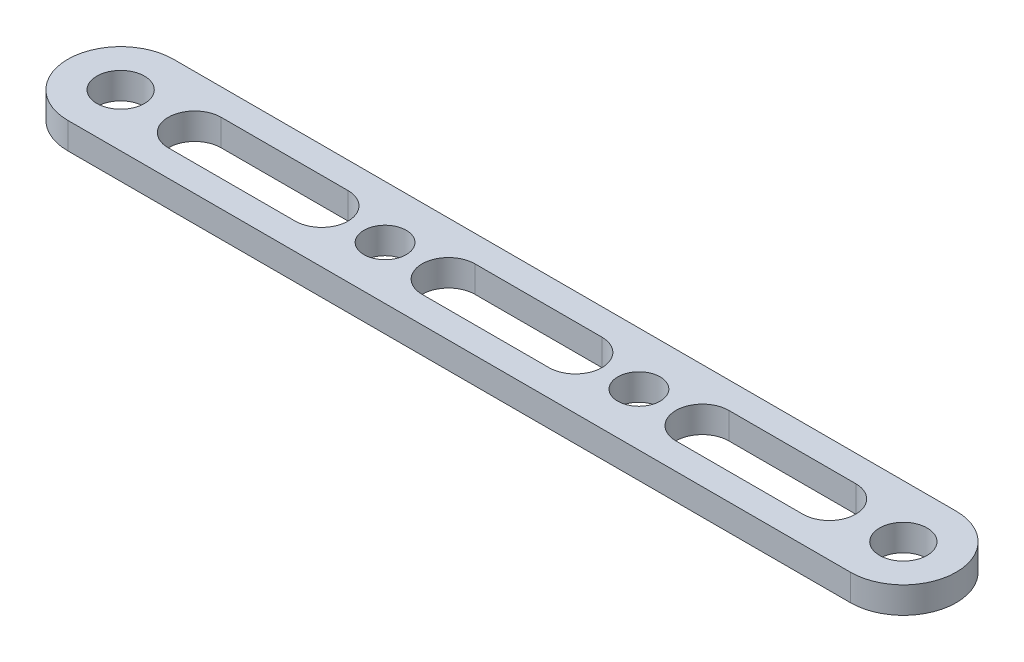
ISO-10303-21;
HEADER;
FILE_DESCRIPTION(('STEP AP214'),'2;1');
FILE_NAME('part.step','',(''),(''),'','','');
FILE_SCHEMA(('AUTOMOTIVE_DESIGN { 1 0 10303 214 1 1 1 1 }'));
ENDSEC;
DATA;
#1=APPLICATION_CONTEXT('core data for automotive mechanical design processes');
#2=APPLICATION_PROTOCOL_DEFINITION('international standard','automotive_design',2000,#1);
#3=PRODUCT_CONTEXT('',#1,'mechanical');
#4=PRODUCT('Part','Part','',(#3));
#5=PRODUCT_RELATED_PRODUCT_CATEGORY('part','',(#4));
#6=PRODUCT_DEFINITION_FORMATION('','',#4);
#7=PRODUCT_DEFINITION_CONTEXT('part definition',#1,'design');
#8=PRODUCT_DEFINITION('design','',#6,#7);
#9=PRODUCT_DEFINITION_SHAPE('','',#8);
#10=(LENGTH_UNIT() NAMED_UNIT(*) SI_UNIT(.MILLI.,.METRE.));
#11=(NAMED_UNIT(*) PLANE_ANGLE_UNIT() SI_UNIT($,.RADIAN.));
#12=(NAMED_UNIT(*) SI_UNIT($,.STERADIAN.) SOLID_ANGLE_UNIT());
#13=UNCERTAINTY_MEASURE_WITH_UNIT(LENGTH_MEASURE(1.E-05),#10,'distance_accuracy_value','');
#14=(GEOMETRIC_REPRESENTATION_CONTEXT(3) GLOBAL_UNCERTAINTY_ASSIGNED_CONTEXT((#13)) GLOBAL_UNIT_ASSIGNED_CONTEXT((#10,
#11,#12)) REPRESENTATION_CONTEXT('',''));
#15=CARTESIAN_POINT('',(0.,0.,0.));
#16=DIRECTION('',(0.,0.,1.));
#17=DIRECTION('',(1.,0.,0.));
#18=AXIS2_PLACEMENT_3D('',#15,#16,#17);
#19=CARTESIAN_POINT('',(-74.,5.,0.));
#20=DIRECTION('',(0.,1.,0.));
#21=DIRECTION('',(0.,0.,1.));
#22=AXIS2_PLACEMENT_3D('',#19,#20,#21);
#23=PLANE('',#22);
#24=DIRECTION('',(-1.,0.,0.));
#25=VECTOR('',#24,1.);
#26=CARTESIAN_POINT('',(60.,5.,-4.99999999999999));
#27=LINE('',#26,#25);
#28=CARTESIAN_POINT('',(60.,5.,-4.99999999999999));
#29=VERTEX_POINT('',#28);
#30=CARTESIAN_POINT('',(36.,5.,-4.99999999999999));
#31=VERTEX_POINT('',#30);
#32=EDGE_CURVE('E155',#29,#31,#27,.T.);
#33=ORIENTED_EDGE('',*,*,#32,.F.);
#34=CARTESIAN_POINT('',(60.,5.,0.));
#35=DIRECTION('',(0.,1.,0.));
#36=DIRECTION('',(0.,0.,-1.));
#37=AXIS2_PLACEMENT_3D('',#34,#35,#36);
#38=CIRCLE('',#37,4.99999999999999);
#39=CARTESIAN_POINT('',(60.,5.,4.99999999999999));
#40=VERTEX_POINT('',#39);
#41=EDGE_CURVE('E147',#40,#29,#38,.T.);
#42=ORIENTED_EDGE('',*,*,#41,.F.);
#43=DIRECTION('',(1.,0.,0.));
#44=VECTOR('',#43,1.);
#45=CARTESIAN_POINT('',(60.,5.,4.99999999999999));
#46=LINE('',#45,#44);
#47=CARTESIAN_POINT('',(36.,5.,4.99999999999999));
#48=VERTEX_POINT('',#47);
#49=EDGE_CURVE('E170',#48,#40,#46,.T.);
#50=ORIENTED_EDGE('',*,*,#49,.F.);
#51=CARTESIAN_POINT('',(36.,5.,0.));
#52=DIRECTION('',(0.,1.,0.));
#53=DIRECTION('',(0.,0.,-1.));
#54=AXIS2_PLACEMENT_3D('',#51,#52,#53);
#55=CIRCLE('',#54,4.99999999999999);
#56=EDGE_CURVE('E168',#31,#48,#55,.T.);
#57=ORIENTED_EDGE('',*,*,#56,.F.);
#58=EDGE_LOOP('',(#33,#42,#50,#57));
#59=FACE_BOUND('',#58,.T.);
#60=CARTESIAN_POINT('',(-24.,5.,0.));
#61=DIRECTION('',(0.,1.,0.));
#62=DIRECTION('',(0.,0.,1.));
#63=AXIS2_PLACEMENT_3D('',#60,#61,#62);
#64=CIRCLE('',#63,4.);
#65=CARTESIAN_POINT('',(-24.,5.,4.));
#66=VERTEX_POINT('',#65);
#67=EDGE_CURVE('E186',#66,#66,#64,.T.);
#68=ORIENTED_EDGE('',*,*,#67,.F.);
#69=EDGE_LOOP('',(#68));
#70=FACE_BOUND('',#69,.T.);
#71=CARTESIAN_POINT('',(74.,5.,0.));
#72=DIRECTION('',(0.,1.,0.));
#73=DIRECTION('',(0.,0.,1.));
#74=AXIS2_PLACEMENT_3D('',#71,#72,#73);
#75=CIRCLE('',#74,4.5);
#76=CARTESIAN_POINT('',(74.,5.,4.49999999999998));
#77=VERTEX_POINT('',#76);
#78=EDGE_CURVE('E260',#77,#77,#75,.T.);
#79=ORIENTED_EDGE('',*,*,#78,.F.);
#80=EDGE_LOOP('',(#79));
#81=FACE_BOUND('',#80,.T.);
#82=CARTESIAN_POINT('',(-74.,5.,0.));
#83=DIRECTION('',(0.,1.,0.));
#84=DIRECTION('',(0.,0.,1.));
#85=AXIS2_PLACEMENT_3D('',#82,#83,#84);
#86=CIRCLE('',#85,10.);
#87=CARTESIAN_POINT('',(-74.,5.,-10.));
#88=VERTEX_POINT('',#87);
#89=CARTESIAN_POINT('',(-74.,5.,10.));
#90=VERTEX_POINT('',#89);
#91=EDGE_CURVE('E266',#88,#90,#86,.T.);
#92=ORIENTED_EDGE('',*,*,#91,.T.);
#93=DIRECTION('',(1.,0.,0.));
#94=VECTOR('',#93,1.);
#95=CARTESIAN_POINT('',(-74.,5.,10.));
#96=LINE('',#95,#94);
#97=CARTESIAN_POINT('',(74.,5.,10.));
#98=VERTEX_POINT('',#97);
#99=EDGE_CURVE('E269',#90,#98,#96,.T.);
#100=ORIENTED_EDGE('',*,*,#99,.T.);
#101=CARTESIAN_POINT('',(74.,5.,0.));
#102=DIRECTION('',(0.,1.,0.));
#103=DIRECTION('',(0.,0.,1.));
#104=AXIS2_PLACEMENT_3D('',#101,#102,#103);
#105=CIRCLE('',#104,10.);
#106=CARTESIAN_POINT('',(74.,5.,-10.0000000000001));
#107=VERTEX_POINT('',#106);
#108=EDGE_CURVE('E272',#98,#107,#105,.T.);
#109=ORIENTED_EDGE('',*,*,#108,.T.);
#110=DIRECTION('',(-1.,0.,0.));
#111=VECTOR('',#110,1.);
#112=CARTESIAN_POINT('',(-74.,5.,-10.));
#113=LINE('',#112,#111);
#114=EDGE_CURVE('E274',#107,#88,#113,.T.);
#115=ORIENTED_EDGE('',*,*,#114,.T.);
#116=EDGE_LOOP('',(#92,#100,#109,#115));
#117=FACE_BOUND('',#116,.T.);
#118=CARTESIAN_POINT('',(-74.,5.,0.));
#119=DIRECTION('',(0.,1.,0.));
#120=DIRECTION('',(0.,0.,1.));
#121=AXIS2_PLACEMENT_3D('',#118,#119,#120);
#122=CIRCLE('',#121,4.5);
#123=CARTESIAN_POINT('',(-74.,5.,4.5));
#124=VERTEX_POINT('',#123);
#125=EDGE_CURVE('E254',#124,#124,#122,.T.);
#126=ORIENTED_EDGE('',*,*,#125,.F.);
#127=EDGE_LOOP('',(#126));
#128=FACE_BOUND('',#127,.T.);
#129=DIRECTION('',(1.,0.,0.));
#130=VECTOR('',#129,1.);
#131=CARTESIAN_POINT('',(-60.,5.,4.99999999999999));
#132=LINE('',#131,#130);
#133=CARTESIAN_POINT('',(-60.,5.,4.99999999999999));
#134=VERTEX_POINT('',#133);
#135=CARTESIAN_POINT('',(-36.,5.,4.99999999999999));
#136=VERTEX_POINT('',#135);
#137=EDGE_CURVE('E225',#134,#136,#132,.T.);
#138=ORIENTED_EDGE('',*,*,#137,.F.);
#139=CARTESIAN_POINT('',(-60.,5.,0.));
#140=DIRECTION('',(0.,1.,0.));
#141=DIRECTION('',(0.,0.,1.));
#142=AXIS2_PLACEMENT_3D('',#139,#140,#141);
#143=CIRCLE('',#142,4.99999999999999);
#144=CARTESIAN_POINT('',(-60.,5.,-4.99999999999999));
#145=VERTEX_POINT('',#144);
#146=EDGE_CURVE('E223',#145,#134,#143,.T.);
#147=ORIENTED_EDGE('',*,*,#146,.F.);
#148=DIRECTION('',(-1.,0.,0.));
#149=VECTOR('',#148,1.);
#150=CARTESIAN_POINT('',(-60.,5.,-4.99999999999999));
#151=LINE('',#150,#149);
#152=CARTESIAN_POINT('',(-36.,5.,-4.99999999999999));
#153=VERTEX_POINT('',#152);
#154=EDGE_CURVE('E231',#153,#145,#151,.T.);
#155=ORIENTED_EDGE('',*,*,#154,.F.);
#156=CARTESIAN_POINT('',(-36.,5.,0.));
#157=DIRECTION('',(0.,1.,0.));
#158=DIRECTION('',(0.,0.,1.));
#159=AXIS2_PLACEMENT_3D('',#156,#157,#158);
#160=CIRCLE('',#159,4.99999999999999);
#161=EDGE_CURVE('E228',#136,#153,#160,.T.);
#162=ORIENTED_EDGE('',*,*,#161,.F.);
#163=EDGE_LOOP('',(#138,#147,#155,#162));
#164=FACE_BOUND('',#163,.T.);
#165=DIRECTION('',(1.,0.,0.));
#166=VECTOR('',#165,1.);
#167=CARTESIAN_POINT('',(-12.,5.,5.));
#168=LINE('',#167,#166);
#169=CARTESIAN_POINT('',(-12.,5.,5.));
#170=VERTEX_POINT('',#169);
#171=CARTESIAN_POINT('',(12.,5.,5.));
#172=VERTEX_POINT('',#171);
#173=EDGE_CURVE('E194',#170,#172,#168,.T.);
#174=ORIENTED_EDGE('',*,*,#173,.F.);
#175=CARTESIAN_POINT('',(-12.,5.,0.));
#176=DIRECTION('',(0.,1.,0.));
#177=DIRECTION('',(0.,0.,1.));
#178=AXIS2_PLACEMENT_3D('',#175,#176,#177);
#179=CIRCLE('',#178,5.);
#180=CARTESIAN_POINT('',(-12.,5.,-5.));
#181=VERTEX_POINT('',#180);
#182=EDGE_CURVE('E192',#181,#170,#179,.T.);
#183=ORIENTED_EDGE('',*,*,#182,.F.);
#184=DIRECTION('',(-1.,0.,0.));
#185=VECTOR('',#184,1.);
#186=CARTESIAN_POINT('',(-12.,5.,-5.));
#187=LINE('',#186,#185);
#188=CARTESIAN_POINT('',(12.,5.,-5.));
#189=VERTEX_POINT('',#188);
#190=EDGE_CURVE('E200',#189,#181,#187,.T.);
#191=ORIENTED_EDGE('',*,*,#190,.F.);
#192=CARTESIAN_POINT('',(12.,5.,0.));
#193=DIRECTION('',(0.,1.,0.));
#194=DIRECTION('',(0.,0.,1.));
#195=AXIS2_PLACEMENT_3D('',#192,#193,#194);
#196=CIRCLE('',#195,5.);
#197=EDGE_CURVE('E197',#172,#189,#196,.T.);
#198=ORIENTED_EDGE('',*,*,#197,.F.);
#199=EDGE_LOOP('',(#174,#183,#191,#198));
#200=FACE_BOUND('',#199,.T.);
#201=CARTESIAN_POINT('',(24.,5.,0.));
#202=DIRECTION('',(0.,1.,0.));
#203=DIRECTION('',(0.,0.,-1.));
#204=AXIS2_PLACEMENT_3D('',#201,#202,#203);
#205=CIRCLE('',#204,4.);
#206=CARTESIAN_POINT('',(24.,5.,-4.));
#207=VERTEX_POINT('',#206);
#208=EDGE_CURVE('E176',#207,#207,#205,.T.);
#209=ORIENTED_EDGE('',*,*,#208,.F.);
#210=EDGE_LOOP('',(#209));
#211=FACE_BOUND('',#210,.T.);
#212=ADVANCED_FACE('F34',(#59,#70,#81,#117,#128,#164,#200,#211),#23,.T.);
#213=CARTESIAN_POINT('',(-74.,0.,0.));
#214=DIRECTION('',(0.,1.,0.));
#215=DIRECTION('',(0.,0.,1.));
#216=AXIS2_PLACEMENT_3D('',#213,#214,#215);
#217=PLANE('',#216);
#218=CARTESIAN_POINT('',(-24.,0.,0.));
#219=DIRECTION('',(0.,1.,0.));
#220=DIRECTION('',(0.,0.,1.));
#221=AXIS2_PLACEMENT_3D('',#218,#219,#220);
#222=CIRCLE('',#221,4.);
#223=CARTESIAN_POINT('',(-24.,0.,4.));
#224=VERTEX_POINT('',#223);
#225=EDGE_CURVE('E163',#224,#224,#222,.T.);
#226=ORIENTED_EDGE('',*,*,#225,.T.);
#227=EDGE_LOOP('',(#226));
#228=FACE_BOUND('',#227,.T.);
#229=CARTESIAN_POINT('',(-12.,0.,0.));
#230=DIRECTION('',(0.,1.,0.));
#231=DIRECTION('',(0.,0.,1.));
#232=AXIS2_PLACEMENT_3D('',#229,#230,#231);
#233=CIRCLE('',#232,5.);
#234=CARTESIAN_POINT('',(-12.,0.,-5.));
#235=VERTEX_POINT('',#234);
#236=CARTESIAN_POINT('',(-12.,0.,5.));
#237=VERTEX_POINT('',#236);
#238=EDGE_CURVE('E189',#235,#237,#233,.T.);
#239=ORIENTED_EDGE('',*,*,#238,.T.);
#240=DIRECTION('',(1.,0.,0.));
#241=VECTOR('',#240,1.);
#242=CARTESIAN_POINT('',(-12.,0.,5.));
#243=LINE('',#242,#241);
#244=CARTESIAN_POINT('',(12.,0.,5.));
#245=VERTEX_POINT('',#244);
#246=EDGE_CURVE('E205',#237,#245,#243,.T.);
#247=ORIENTED_EDGE('',*,*,#246,.T.);
#248=CARTESIAN_POINT('',(12.,0.,0.));
#249=DIRECTION('',(0.,1.,0.));
#250=DIRECTION('',(0.,0.,1.));
#251=AXIS2_PLACEMENT_3D('',#248,#249,#250);
#252=CIRCLE('',#251,5.);
#253=CARTESIAN_POINT('',(12.,0.,-5.));
#254=VERTEX_POINT('',#253);
#255=EDGE_CURVE('E208',#245,#254,#252,.T.);
#256=ORIENTED_EDGE('',*,*,#255,.T.);
#257=DIRECTION('',(-1.,0.,0.));
#258=VECTOR('',#257,1.);
#259=CARTESIAN_POINT('',(-12.,0.,-5.));
#260=LINE('',#259,#258);
#261=EDGE_CURVE('E195',#254,#235,#260,.T.);
#262=ORIENTED_EDGE('',*,*,#261,.T.);
#263=EDGE_LOOP('',(#239,#247,#256,#262));
#264=FACE_BOUND('',#263,.T.);
#265=CARTESIAN_POINT('',(-74.,0.,0.));
#266=DIRECTION('',(0.,1.,0.));
#267=DIRECTION('',(0.,0.,1.));
#268=AXIS2_PLACEMENT_3D('',#265,#266,#267);
#269=CIRCLE('',#268,4.5);
#270=CARTESIAN_POINT('',(-74.,0.,4.5));
#271=VERTEX_POINT('',#270);
#272=EDGE_CURVE('E253',#271,#271,#269,.T.);
#273=ORIENTED_EDGE('',*,*,#272,.T.);
#274=EDGE_LOOP('',(#273));
#275=FACE_BOUND('',#274,.T.);
#276=CARTESIAN_POINT('',(74.,0.,0.));
#277=DIRECTION('',(0.,1.,0.));
#278=DIRECTION('',(0.,0.,1.));
#279=AXIS2_PLACEMENT_3D('',#276,#277,#278);
#280=CIRCLE('',#279,4.5);
#281=CARTESIAN_POINT('',(74.,0.,4.49999999999998));
#282=VERTEX_POINT('',#281);
#283=EDGE_CURVE('E257',#282,#282,#280,.T.);
#284=ORIENTED_EDGE('',*,*,#283,.T.);
#285=EDGE_LOOP('',(#284));
#286=FACE_BOUND('',#285,.T.);
#287=CARTESIAN_POINT('',(-74.,0.,0.));
#288=DIRECTION('',(0.,1.,0.));
#289=DIRECTION('',(0.,0.,1.));
#290=AXIS2_PLACEMENT_3D('',#287,#288,#289);
#291=CIRCLE('',#290,10.);
#292=CARTESIAN_POINT('',(-74.,0.,-10.));
#293=VERTEX_POINT('',#292);
#294=CARTESIAN_POINT('',(-74.,0.,10.));
#295=VERTEX_POINT('',#294);
#296=EDGE_CURVE('E263',#293,#295,#291,.T.);
#297=ORIENTED_EDGE('',*,*,#296,.F.);
#298=DIRECTION('',(-1.,0.,0.));
#299=VECTOR('',#298,1.);
#300=CARTESIAN_POINT('',(-74.,0.,-10.));
#301=LINE('',#300,#299);
#302=CARTESIAN_POINT('',(74.,0.,-10.0000000000001));
#303=VERTEX_POINT('',#302);
#304=EDGE_CURVE('E270',#303,#293,#301,.T.);
#305=ORIENTED_EDGE('',*,*,#304,.F.);
#306=CARTESIAN_POINT('',(74.,0.,0.));
#307=DIRECTION('',(0.,1.,0.));
#308=DIRECTION('',(0.,0.,1.));
#309=AXIS2_PLACEMENT_3D('',#306,#307,#308);
#310=CIRCLE('',#309,10.);
#311=CARTESIAN_POINT('',(74.,0.,10.));
#312=VERTEX_POINT('',#311);
#313=EDGE_CURVE('E281',#312,#303,#310,.T.);
#314=ORIENTED_EDGE('',*,*,#313,.F.);
#315=DIRECTION('',(1.,0.,0.));
#316=VECTOR('',#315,1.);
#317=CARTESIAN_POINT('',(-74.,0.,10.));
#318=LINE('',#317,#316);
#319=EDGE_CURVE('E279',#295,#312,#318,.T.);
#320=ORIENTED_EDGE('',*,*,#319,.F.);
#321=EDGE_LOOP('',(#297,#305,#314,#320));
#322=FACE_BOUND('',#321,.T.);
#323=CARTESIAN_POINT('',(-60.,0.,0.));
#324=DIRECTION('',(0.,1.,0.));
#325=DIRECTION('',(0.,0.,1.));
#326=AXIS2_PLACEMENT_3D('',#323,#324,#325);
#327=CIRCLE('',#326,4.99999999999999);
#328=CARTESIAN_POINT('',(-60.,0.,-4.99999999999999));
#329=VERTEX_POINT('',#328);
#330=CARTESIAN_POINT('',(-60.,0.,4.99999999999999));
#331=VERTEX_POINT('',#330);
#332=EDGE_CURVE('E222',#329,#331,#327,.T.);
#333=ORIENTED_EDGE('',*,*,#332,.T.);
#334=DIRECTION('',(1.,0.,0.));
#335=VECTOR('',#334,1.);
#336=CARTESIAN_POINT('',(-60.,0.,4.99999999999999));
#337=LINE('',#336,#335);
#338=CARTESIAN_POINT('',(-36.,0.,4.99999999999999));
#339=VERTEX_POINT('',#338);
#340=EDGE_CURVE('E236',#331,#339,#337,.T.);
#341=ORIENTED_EDGE('',*,*,#340,.T.);
#342=CARTESIAN_POINT('',(-36.,0.,0.));
#343=DIRECTION('',(0.,1.,0.));
#344=DIRECTION('',(0.,0.,1.));
#345=AXIS2_PLACEMENT_3D('',#342,#343,#344);
#346=CIRCLE('',#345,4.99999999999999);
#347=CARTESIAN_POINT('',(-36.,0.,-4.99999999999999));
#348=VERTEX_POINT('',#347);
#349=EDGE_CURVE('E239',#339,#348,#346,.T.);
#350=ORIENTED_EDGE('',*,*,#349,.T.);
#351=DIRECTION('',(-1.,0.,0.));
#352=VECTOR('',#351,1.);
#353=CARTESIAN_POINT('',(-60.,0.,-4.99999999999999));
#354=LINE('',#353,#352);
#355=EDGE_CURVE('E226',#348,#329,#354,.T.);
#356=ORIENTED_EDGE('',*,*,#355,.T.);
#357=EDGE_LOOP('',(#333,#341,#350,#356));
#358=FACE_BOUND('',#357,.T.);
#359=CARTESIAN_POINT('',(60.,0.,0.));
#360=DIRECTION('',(0.,1.,0.));
#361=DIRECTION('',(0.,0.,-1.));
#362=AXIS2_PLACEMENT_3D('',#359,#360,#361);
#363=CIRCLE('',#362,4.99999999999999);
#364=CARTESIAN_POINT('',(60.,0.,4.99999999999999));
#365=VERTEX_POINT('',#364);
#366=CARTESIAN_POINT('',(60.,0.,-4.99999999999999));
#367=VERTEX_POINT('',#366);
#368=EDGE_CURVE('E57',#365,#367,#363,.T.);
#369=ORIENTED_EDGE('',*,*,#368,.T.);
#370=DIRECTION('',(-1.,0.,0.));
#371=VECTOR('',#370,1.);
#372=CARTESIAN_POINT('',(60.,0.,-4.99999999999999));
#373=LINE('',#372,#371);
#374=CARTESIAN_POINT('',(36.,0.,-4.99999999999999));
#375=VERTEX_POINT('',#374);
#376=EDGE_CURVE('E162',#367,#375,#373,.T.);
#377=ORIENTED_EDGE('',*,*,#376,.T.);
#378=CARTESIAN_POINT('',(36.,0.,0.));
#379=DIRECTION('',(0.,1.,0.));
#380=DIRECTION('',(0.,0.,-1.));
#381=AXIS2_PLACEMENT_3D('',#378,#379,#380);
#382=CIRCLE('',#381,4.99999999999999);
#383=CARTESIAN_POINT('',(36.,0.,4.99999999999999));
#384=VERTEX_POINT('',#383);
#385=EDGE_CURVE('E178',#375,#384,#382,.T.);
#386=ORIENTED_EDGE('',*,*,#385,.T.);
#387=DIRECTION('',(1.,0.,0.));
#388=VECTOR('',#387,1.);
#389=CARTESIAN_POINT('',(60.,0.,4.99999999999999));
#390=LINE('',#389,#388);
#391=EDGE_CURVE('E156',#384,#365,#390,.T.);
#392=ORIENTED_EDGE('',*,*,#391,.T.);
#393=EDGE_LOOP('',(#369,#377,#386,#392));
#394=FACE_BOUND('',#393,.T.);
#395=CARTESIAN_POINT('',(24.,0.,0.));
#396=DIRECTION('',(0.,1.,0.));
#397=DIRECTION('',(0.,0.,-1.));
#398=AXIS2_PLACEMENT_3D('',#395,#396,#397);
#399=CIRCLE('',#398,4.);
#400=CARTESIAN_POINT('',(24.,0.,-4.));
#401=VERTEX_POINT('',#400);
#402=EDGE_CURVE('E404',#401,#401,#399,.T.);
#403=ORIENTED_EDGE('',*,*,#402,.T.);
#404=EDGE_LOOP('',(#403));
#405=FACE_BOUND('',#404,.T.);
#406=ADVANCED_FACE('F299',(#228,#264,#275,#286,#322,#358,#394,#405),#217,.F.);
#407=CARTESIAN_POINT('',(-74.,5.,0.));
#408=DIRECTION('',(0.,-1.,0.));
#409=DIRECTION('',(0.,0.,-1.));
#410=AXIS2_PLACEMENT_3D('',#407,#408,#409);
#411=CYLINDRICAL_SURFACE('',#410,10.);
#412=ORIENTED_EDGE('',*,*,#296,.T.);
#413=DIRECTION('',(0.,-1.,0.));
#414=VECTOR('',#413,1.);
#415=CARTESIAN_POINT('',(-74.,5.,10.));
#416=LINE('',#415,#414);
#417=EDGE_CURVE('E11',#90,#295,#416,.T.);
#418=ORIENTED_EDGE('',*,*,#417,.F.);
#419=ORIENTED_EDGE('',*,*,#91,.F.);
#420=DIRECTION('',(0.,-1.,0.));
#421=VECTOR('',#420,1.);
#422=CARTESIAN_POINT('',(-74.,5.,-10.));
#423=LINE('',#422,#421);
#424=EDGE_CURVE('E276',#88,#293,#423,.T.);
#425=ORIENTED_EDGE('',*,*,#424,.T.);
#426=EDGE_LOOP('',(#412,#418,#419,#425));
#427=FACE_BOUND('',#426,.T.);
#428=ADVANCED_FACE('F36',(#427),#411,.T.);
#429=CARTESIAN_POINT('',(-74.,5.,10.));
#430=DIRECTION('',(0.,0.,-1.));
#431=DIRECTION('',(-1.,0.,0.));
#432=AXIS2_PLACEMENT_3D('',#429,#430,#431);
#433=PLANE('',#432);
#434=ORIENTED_EDGE('',*,*,#319,.T.);
#435=DIRECTION('',(0.,-1.,0.));
#436=VECTOR('',#435,1.);
#437=CARTESIAN_POINT('',(74.,5.,10.));
#438=LINE('',#437,#436);
#439=EDGE_CURVE('E42',#98,#312,#438,.T.);
#440=ORIENTED_EDGE('',*,*,#439,.F.);
#441=ORIENTED_EDGE('',*,*,#99,.F.);
#442=ORIENTED_EDGE('',*,*,#417,.T.);
#443=EDGE_LOOP('',(#434,#440,#441,#442));
#444=FACE_BOUND('',#443,.T.);
#445=ADVANCED_FACE('F310',(#444),#433,.F.);
#446=CARTESIAN_POINT('',(74.,5.,0.));
#447=DIRECTION('',(0.,-1.,0.));
#448=DIRECTION('',(0.,0.,-1.));
#449=AXIS2_PLACEMENT_3D('',#446,#447,#448);
#450=CYLINDRICAL_SURFACE('',#449,10.);
#451=ORIENTED_EDGE('',*,*,#313,.T.);
#452=DIRECTION('',(0.,-1.,0.));
#453=VECTOR('',#452,1.);
#454=CARTESIAN_POINT('',(74.,5.,-10.0000000000001));
#455=LINE('',#454,#453);
#456=EDGE_CURVE('E286',#107,#303,#455,.T.);
#457=ORIENTED_EDGE('',*,*,#456,.F.);
#458=ORIENTED_EDGE('',*,*,#108,.F.);
#459=ORIENTED_EDGE('',*,*,#439,.T.);
#460=EDGE_LOOP('',(#451,#457,#458,#459));
#461=FACE_BOUND('',#460,.T.);
#462=ADVANCED_FACE('F293',(#461),#450,.T.);
#463=CARTESIAN_POINT('',(-74.,5.,-10.));
#464=DIRECTION('',(0.,0.,1.));
#465=DIRECTION('',(1.,0.,0.));
#466=AXIS2_PLACEMENT_3D('',#463,#464,#465);
#467=PLANE('',#466);
#468=ORIENTED_EDGE('',*,*,#304,.T.);
#469=ORIENTED_EDGE('',*,*,#424,.F.);
#470=ORIENTED_EDGE('',*,*,#114,.F.);
#471=ORIENTED_EDGE('',*,*,#456,.T.);
#472=EDGE_LOOP('',(#468,#469,#470,#471));
#473=FACE_BOUND('',#472,.T.);
#474=ADVANCED_FACE('F303',(#473),#467,.F.);
#475=CARTESIAN_POINT('',(74.,5.,0.));
#476=DIRECTION('',(0.,-1.,0.));
#477=DIRECTION('',(0.,0.,-1.));
#478=AXIS2_PLACEMENT_3D('',#475,#476,#477);
#479=CYLINDRICAL_SURFACE('',#478,4.5);
#480=ORIENTED_EDGE('',*,*,#78,.T.);
#481=EDGE_LOOP('',(#480));
#482=FACE_BOUND('',#481,.T.);
#483=ORIENTED_EDGE('',*,*,#283,.F.);
#484=EDGE_LOOP('',(#483));
#485=FACE_BOUND('',#484,.T.);
#486=ADVANCED_FACE('F325',(#482,#485),#479,.F.);
#487=CARTESIAN_POINT('',(-74.,5.,0.));
#488=DIRECTION('',(0.,-1.,0.));
#489=DIRECTION('',(0.,0.,-1.));
#490=AXIS2_PLACEMENT_3D('',#487,#488,#489);
#491=CYLINDRICAL_SURFACE('',#490,4.5);
#492=ORIENTED_EDGE('',*,*,#125,.T.);
#493=EDGE_LOOP('',(#492));
#494=FACE_BOUND('',#493,.T.);
#495=ORIENTED_EDGE('',*,*,#272,.F.);
#496=EDGE_LOOP('',(#495));
#497=FACE_BOUND('',#496,.T.);
#498=ADVANCED_FACE('F332',(#494,#497),#491,.F.);
#499=CARTESIAN_POINT('',(-60.,5.,0.));
#500=DIRECTION('',(0.,-1.,0.));
#501=DIRECTION('',(0.,0.,-1.));
#502=AXIS2_PLACEMENT_3D('',#499,#500,#501);
#503=CYLINDRICAL_SURFACE('',#502,4.99999999999999);
#504=ORIENTED_EDGE('',*,*,#332,.F.);
#505=DIRECTION('',(0.,-1.,0.));
#506=VECTOR('',#505,1.);
#507=CARTESIAN_POINT('',(-60.,5.,-4.99999999999999));
#508=LINE('',#507,#506);
#509=EDGE_CURVE('E233',#145,#329,#508,.T.);
#510=ORIENTED_EDGE('',*,*,#509,.F.);
#511=ORIENTED_EDGE('',*,*,#146,.T.);
#512=DIRECTION('',(0.,-1.,0.));
#513=VECTOR('',#512,1.);
#514=CARTESIAN_POINT('',(-60.,5.,4.99999999999999));
#515=LINE('',#514,#513);
#516=EDGE_CURVE('E250',#134,#331,#515,.T.);
#517=ORIENTED_EDGE('',*,*,#516,.T.);
#518=EDGE_LOOP('',(#504,#510,#511,#517));
#519=FACE_BOUND('',#518,.T.);
#520=ADVANCED_FACE('F337',(#519),#503,.F.);
#521=CARTESIAN_POINT('',(-60.,5.,4.99999999999999));
#522=DIRECTION('',(0.,0.,-1.));
#523=DIRECTION('',(-1.,0.,0.));
#524=AXIS2_PLACEMENT_3D('',#521,#522,#523);
#525=PLANE('',#524);
#526=ORIENTED_EDGE('',*,*,#340,.F.);
#527=ORIENTED_EDGE('',*,*,#516,.F.);
#528=ORIENTED_EDGE('',*,*,#137,.T.);
#529=DIRECTION('',(0.,-1.,0.));
#530=VECTOR('',#529,1.);
#531=CARTESIAN_POINT('',(-36.,5.,4.99999999999999));
#532=LINE('',#531,#530);
#533=EDGE_CURVE('E248',#136,#339,#532,.T.);
#534=ORIENTED_EDGE('',*,*,#533,.T.);
#535=EDGE_LOOP('',(#526,#527,#528,#534));
#536=FACE_BOUND('',#535,.T.);
#537=ADVANCED_FACE('F347',(#536),#525,.T.);
#538=CARTESIAN_POINT('',(-36.,5.,0.));
#539=DIRECTION('',(0.,-1.,0.));
#540=DIRECTION('',(0.,0.,-1.));
#541=AXIS2_PLACEMENT_3D('',#538,#539,#540);
#542=CYLINDRICAL_SURFACE('',#541,4.99999999999999);
#543=ORIENTED_EDGE('',*,*,#349,.F.);
#544=ORIENTED_EDGE('',*,*,#533,.F.);
#545=ORIENTED_EDGE('',*,*,#161,.T.);
#546=DIRECTION('',(0.,-1.,0.));
#547=VECTOR('',#546,1.);
#548=CARTESIAN_POINT('',(-36.,5.,-4.99999999999999));
#549=LINE('',#548,#547);
#550=EDGE_CURVE('E246',#153,#348,#549,.T.);
#551=ORIENTED_EDGE('',*,*,#550,.T.);
#552=EDGE_LOOP('',(#543,#544,#545,#551));
#553=FACE_BOUND('',#552,.T.);
#554=ADVANCED_FACE('F354',(#553),#542,.F.);
#555=CARTESIAN_POINT('',(-60.,5.,-4.99999999999999));
#556=DIRECTION('',(0.,0.,1.));
#557=DIRECTION('',(1.,0.,0.));
#558=AXIS2_PLACEMENT_3D('',#555,#556,#557);
#559=PLANE('',#558);
#560=ORIENTED_EDGE('',*,*,#355,.F.);
#561=ORIENTED_EDGE('',*,*,#550,.F.);
#562=ORIENTED_EDGE('',*,*,#154,.T.);
#563=ORIENTED_EDGE('',*,*,#509,.T.);
#564=EDGE_LOOP('',(#560,#561,#562,#563));
#565=FACE_BOUND('',#564,.T.);
#566=ADVANCED_FACE('F358',(#565),#559,.T.);
#567=CARTESIAN_POINT('',(-12.,5.,0.));
#568=DIRECTION('',(0.,-1.,0.));
#569=DIRECTION('',(0.,0.,-1.));
#570=AXIS2_PLACEMENT_3D('',#567,#568,#569);
#571=CYLINDRICAL_SURFACE('',#570,5.);
#572=ORIENTED_EDGE('',*,*,#238,.F.);
#573=DIRECTION('',(0.,-1.,0.));
#574=VECTOR('',#573,1.);
#575=CARTESIAN_POINT('',(-12.,5.,-5.));
#576=LINE('',#575,#574);
#577=EDGE_CURVE('E202',#181,#235,#576,.T.);
#578=ORIENTED_EDGE('',*,*,#577,.F.);
#579=ORIENTED_EDGE('',*,*,#182,.T.);
#580=DIRECTION('',(0.,-1.,0.));
#581=VECTOR('',#580,1.);
#582=CARTESIAN_POINT('',(-12.,5.,5.));
#583=LINE('',#582,#581);
#584=EDGE_CURVE('E219',#170,#237,#583,.T.);
#585=ORIENTED_EDGE('',*,*,#584,.T.);
#586=EDGE_LOOP('',(#572,#578,#579,#585));
#587=FACE_BOUND('',#586,.T.);
#588=ADVANCED_FACE('F362',(#587),#571,.F.);
#589=CARTESIAN_POINT('',(-12.,5.,5.));
#590=DIRECTION('',(0.,0.,-1.));
#591=DIRECTION('',(-1.,0.,0.));
#592=AXIS2_PLACEMENT_3D('',#589,#590,#591);
#593=PLANE('',#592);
#594=ORIENTED_EDGE('',*,*,#246,.F.);
#595=ORIENTED_EDGE('',*,*,#584,.F.);
#596=ORIENTED_EDGE('',*,*,#173,.T.);
#597=DIRECTION('',(0.,-1.,0.));
#598=VECTOR('',#597,1.);
#599=CARTESIAN_POINT('',(12.,5.,5.));
#600=LINE('',#599,#598);
#601=EDGE_CURVE('E217',#172,#245,#600,.T.);
#602=ORIENTED_EDGE('',*,*,#601,.T.);
#603=EDGE_LOOP('',(#594,#595,#596,#602));
#604=FACE_BOUND('',#603,.T.);
#605=ADVANCED_FACE('F366',(#604),#593,.T.);
#606=CARTESIAN_POINT('',(12.,5.,0.));
#607=DIRECTION('',(0.,-1.,0.));
#608=DIRECTION('',(0.,0.,-1.));
#609=AXIS2_PLACEMENT_3D('',#606,#607,#608);
#610=CYLINDRICAL_SURFACE('',#609,5.);
#611=ORIENTED_EDGE('',*,*,#255,.F.);
#612=ORIENTED_EDGE('',*,*,#601,.F.);
#613=ORIENTED_EDGE('',*,*,#197,.T.);
#614=DIRECTION('',(0.,-1.,0.));
#615=VECTOR('',#614,1.);
#616=CARTESIAN_POINT('',(12.,5.,-5.));
#617=LINE('',#616,#615);
#618=EDGE_CURVE('E215',#189,#254,#617,.T.);
#619=ORIENTED_EDGE('',*,*,#618,.T.);
#620=EDGE_LOOP('',(#611,#612,#613,#619));
#621=FACE_BOUND('',#620,.T.);
#622=ADVANCED_FACE('F370',(#621),#610,.F.);
#623=CARTESIAN_POINT('',(-12.,5.,-5.));
#624=DIRECTION('',(0.,0.,1.));
#625=DIRECTION('',(1.,0.,0.));
#626=AXIS2_PLACEMENT_3D('',#623,#624,#625);
#627=PLANE('',#626);
#628=ORIENTED_EDGE('',*,*,#261,.F.);
#629=ORIENTED_EDGE('',*,*,#618,.F.);
#630=ORIENTED_EDGE('',*,*,#190,.T.);
#631=ORIENTED_EDGE('',*,*,#577,.T.);
#632=EDGE_LOOP('',(#628,#629,#630,#631));
#633=FACE_BOUND('',#632,.T.);
#634=ADVANCED_FACE('F374',(#633),#627,.T.);
#635=CARTESIAN_POINT('',(-24.,5.,0.));
#636=DIRECTION('',(0.,-1.,0.));
#637=DIRECTION('',(0.,0.,-1.));
#638=AXIS2_PLACEMENT_3D('',#635,#636,#637);
#639=CYLINDRICAL_SURFACE('',#638,4.);
#640=ORIENTED_EDGE('',*,*,#67,.T.);
#641=EDGE_LOOP('',(#640));
#642=FACE_BOUND('',#641,.T.);
#643=ORIENTED_EDGE('',*,*,#225,.F.);
#644=EDGE_LOOP('',(#643));
#645=FACE_BOUND('',#644,.T.);
#646=ADVANCED_FACE('F378',(#642,#645),#639,.F.);
#647=CARTESIAN_POINT('',(60.,5.,0.));
#648=DIRECTION('',(0.,-1.,0.));
#649=DIRECTION('',(0.,0.,-1.));
#650=AXIS2_PLACEMENT_3D('',#647,#648,#649);
#651=CYLINDRICAL_SURFACE('',#650,4.99999999999999);
#652=ORIENTED_EDGE('',*,*,#368,.F.);
#653=DIRECTION('',(0.,-1.,0.));
#654=VECTOR('',#653,1.);
#655=CARTESIAN_POINT('',(60.,5.,4.99999999999999));
#656=LINE('',#655,#654);
#657=EDGE_CURVE('E151',#40,#365,#656,.T.);
#658=ORIENTED_EDGE('',*,*,#657,.F.);
#659=ORIENTED_EDGE('',*,*,#41,.T.);
#660=DIRECTION('',(0.,-1.,0.));
#661=VECTOR('',#660,1.);
#662=CARTESIAN_POINT('',(60.,5.,-4.99999999999999));
#663=LINE('',#662,#661);
#664=EDGE_CURVE('E150',#29,#367,#663,.T.);
#665=ORIENTED_EDGE('',*,*,#664,.T.);
#666=EDGE_LOOP('',(#652,#658,#659,#665));
#667=FACE_BOUND('',#666,.T.);
#668=ADVANCED_FACE('F149',(#667),#651,.F.);
#669=CARTESIAN_POINT('',(60.,5.,-4.99999999999999));
#670=DIRECTION('',(0.,0.,1.));
#671=DIRECTION('',(1.,0.,0.));
#672=AXIS2_PLACEMENT_3D('',#669,#670,#671);
#673=PLANE('',#672);
#674=ORIENTED_EDGE('',*,*,#376,.F.);
#675=ORIENTED_EDGE('',*,*,#664,.F.);
#676=ORIENTED_EDGE('',*,*,#32,.T.);
#677=DIRECTION('',(0.,-1.,0.));
#678=VECTOR('',#677,1.);
#679=CARTESIAN_POINT('',(36.,5.,-4.99999999999999));
#680=LINE('',#679,#678);
#681=EDGE_CURVE('E164',#31,#375,#680,.T.);
#682=ORIENTED_EDGE('',*,*,#681,.T.);
#683=EDGE_LOOP('',(#674,#675,#676,#682));
#684=FACE_BOUND('',#683,.T.);
#685=ADVANCED_FACE('F159',(#684),#673,.T.);
#686=CARTESIAN_POINT('',(36.,5.,0.));
#687=DIRECTION('',(0.,-1.,0.));
#688=DIRECTION('',(0.,0.,-1.));
#689=AXIS2_PLACEMENT_3D('',#686,#687,#688);
#690=CYLINDRICAL_SURFACE('',#689,4.99999999999999);
#691=ORIENTED_EDGE('',*,*,#385,.F.);
#692=ORIENTED_EDGE('',*,*,#681,.F.);
#693=ORIENTED_EDGE('',*,*,#56,.T.);
#694=DIRECTION('',(0.,-1.,0.));
#695=VECTOR('',#694,1.);
#696=CARTESIAN_POINT('',(36.,5.,4.99999999999999));
#697=LINE('',#696,#695);
#698=EDGE_CURVE('E49',#48,#384,#697,.T.);
#699=ORIENTED_EDGE('',*,*,#698,.T.);
#700=EDGE_LOOP('',(#691,#692,#693,#699));
#701=FACE_BOUND('',#700,.T.);
#702=ADVANCED_FACE('F387',(#701),#690,.F.);
#703=CARTESIAN_POINT('',(60.,5.,4.99999999999999));
#704=DIRECTION('',(0.,0.,-1.));
#705=DIRECTION('',(-1.,0.,0.));
#706=AXIS2_PLACEMENT_3D('',#703,#704,#705);
#707=PLANE('',#706);
#708=ORIENTED_EDGE('',*,*,#391,.F.);
#709=ORIENTED_EDGE('',*,*,#698,.F.);
#710=ORIENTED_EDGE('',*,*,#49,.T.);
#711=ORIENTED_EDGE('',*,*,#657,.T.);
#712=EDGE_LOOP('',(#708,#709,#710,#711));
#713=FACE_BOUND('',#712,.T.);
#714=ADVANCED_FACE('F390',(#713),#707,.T.);
#715=CARTESIAN_POINT('',(24.,5.,0.));
#716=DIRECTION('',(0.,-1.,0.));
#717=DIRECTION('',(0.,0.,-1.));
#718=AXIS2_PLACEMENT_3D('',#715,#716,#717);
#719=CYLINDRICAL_SURFACE('',#718,4.);
#720=ORIENTED_EDGE('',*,*,#208,.T.);
#721=EDGE_LOOP('',(#720));
#722=FACE_BOUND('',#721,.T.);
#723=ORIENTED_EDGE('',*,*,#402,.F.);
#724=EDGE_LOOP('',(#723));
#725=FACE_BOUND('',#724,.T.);
#726=ADVANCED_FACE('F394',(#722,#725),#719,.F.);
#727=CLOSED_SHELL('',(#212,#406,#428,#445,#462,#474,#486,#498,#520,#537,#554,#566,#588,#605,
#622,#634,#646,#668,#685,#702,#714,#726));
#728=MANIFOLD_SOLID_BREP('B2',#727);
#729=ADVANCED_BREP_SHAPE_REPRESENTATION('',(#18,#728),#14);
#730=SHAPE_DEFINITION_REPRESENTATION(#9,#729);
ENDSEC;
END-ISO-10303-21;
